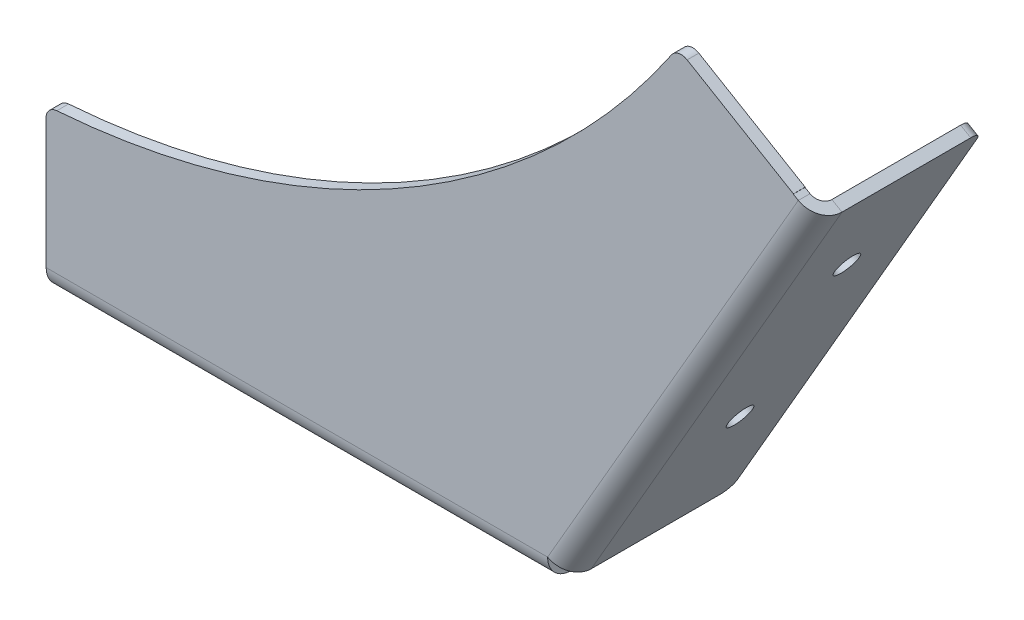
ISO-10303-21;
HEADER;
FILE_DESCRIPTION(('STEP AP214'),'2;1');
FILE_NAME('part.step','',(''),(''),'','','');
FILE_SCHEMA(('AUTOMOTIVE_DESIGN { 1 0 10303 214 1 1 1 1 }'));
ENDSEC;
DATA;
#1=APPLICATION_CONTEXT('core data for automotive mechanical design processes');
#2=APPLICATION_PROTOCOL_DEFINITION('international standard','automotive_design',2000,#1);
#3=PRODUCT_CONTEXT('',#1,'mechanical');
#4=PRODUCT('Part','Part','',(#3));
#5=PRODUCT_RELATED_PRODUCT_CATEGORY('part','',(#4));
#6=PRODUCT_DEFINITION_FORMATION('','',#4);
#7=PRODUCT_DEFINITION_CONTEXT('part definition',#1,'design');
#8=PRODUCT_DEFINITION('design','',#6,#7);
#9=PRODUCT_DEFINITION_SHAPE('','',#8);
#10=(LENGTH_UNIT() NAMED_UNIT(*) SI_UNIT(.MILLI.,.METRE.));
#11=(NAMED_UNIT(*) PLANE_ANGLE_UNIT() SI_UNIT($,.RADIAN.));
#12=(NAMED_UNIT(*) SI_UNIT($,.STERADIAN.) SOLID_ANGLE_UNIT());
#13=UNCERTAINTY_MEASURE_WITH_UNIT(LENGTH_MEASURE(1.E-05),#10,'distance_accuracy_value','');
#14=(GEOMETRIC_REPRESENTATION_CONTEXT(3) GLOBAL_UNCERTAINTY_ASSIGNED_CONTEXT((#13)) GLOBAL_UNIT_ASSIGNED_CONTEXT((#10,
#11,#12)) REPRESENTATION_CONTEXT('',''));
#15=CARTESIAN_POINT('',(0.,0.,0.));
#16=DIRECTION('',(0.,0.,1.));
#17=DIRECTION('',(1.,0.,0.));
#18=AXIS2_PLACEMENT_3D('',#15,#16,#17);
#19=CARTESIAN_POINT('',(0.,0.,-3.175));
#20=DIRECTION('',(0.,0.,-1.));
#21=DIRECTION('',(-1.,0.,0.));
#22=AXIS2_PLACEMENT_3D('',#19,#20,#21);
#23=PLANE('',#22);
#24=CARTESIAN_POINT('',(-152.954688879474,264.874673897743,-3.175));
#25=DIRECTION('',(0.,0.,-1.));
#26=DIRECTION('',(-1.,0.,0.));
#27=AXIS2_PLACEMENT_3D('',#24,#25,#26);
#28=CIRCLE('',#27,220.82);
#29=CARTESIAN_POINT('',(-136.801771923831,44.6462568534753,-3.175));
#30=VERTEX_POINT('',#29);
#31=CARTESIAN_POINT('',(29.9387036206047,141.135111187137,-3.175));
#32=VERTEX_POINT('',#31);
#33=EDGE_CURVE('E440',#30,#32,#28,.F.);
#34=ORIENTED_EDGE('',*,*,#33,.T.);
#35=CARTESIAN_POINT('',(32.5683862634257,139.355955713873,-3.175));
#36=DIRECTION('',(0.,0.,-1.));
#37=DIRECTION('',(-1.,0.,0.));
#38=AXIS2_PLACEMENT_3D('',#35,#36,#37);
#39=CIRCLE('',#38,3.175);
#40=CARTESIAN_POINT('',(34.1853078788145,142.088388602287,-3.175));
#41=VERTEX_POINT('',#40);
#42=EDGE_CURVE('E482',#32,#41,#39,.T.);
#43=ORIENTED_EDGE('',*,*,#42,.T.);
#44=DIRECTION('',(0.860608783752555,-0.509266650516159,0.));
#45=VECTOR('',#44,1.);
#46=CARTESIAN_POINT('',(31.595939562204,143.620651524126,-3.175));
#47=LINE('',#46,#45);
#48=CARTESIAN_POINT('',(63.0185242498125,125.026285818675,-3.17499999999999));
#49=VERTEX_POINT('',#48);
#50=EDGE_CURVE('E408',#41,#49,#47,.T.);
#51=ORIENTED_EDGE('',*,*,#50,.T.);
#52=DIRECTION('',(0.500000000000037,0.866025403784417,0.));
#53=VECTOR('',#52,1.);
#54=CARTESIAN_POINT('',(62.9759233574662,124.952498908683,-3.17499999999999));
#55=LINE('',#54,#53);
#56=CARTESIAN_POINT('',(62.9759233574662,124.952498908683,-3.17499999999999));
#57=VERTEX_POINT('',#56);
#58=EDGE_CURVE('E382',#57,#49,#55,.T.);
#59=ORIENTED_EDGE('',*,*,#58,.F.);
#60=DIRECTION('',(-0.86602540378442,0.500000000000033,0.));
#61=VECTOR('',#60,1.);
#62=CARTESIAN_POINT('',(64.350738685974,124.158748908683,-3.17499999999999));
#63=LINE('',#62,#61);
#64=CARTESIAN_POINT('',(64.350738685974,124.158748908683,-3.17499999999999));
#65=VERTEX_POINT('',#64);
#66=EDGE_CURVE('E377',#65,#57,#63,.T.);
#67=ORIENTED_EDGE('',*,*,#66,.F.);
#68=DIRECTION('',(-0.500000000000036,-0.866025403784418,0.));
#69=VECTOR('',#68,1.);
#70=CARTESIAN_POINT('',(-3.66617420935395,6.35,-3.17499999999999));
#71=LINE('',#70,#69);
#72=CARTESIAN_POINT('',(-3.66617420935391,6.35000000000004,-3.175));
#73=VERTEX_POINT('',#72);
#74=EDGE_CURVE('E300',#73,#65,#71,.F.);
#75=ORIENTED_EDGE('',*,*,#74,.F.);
#76=DIRECTION('',(-1.,0.,0.));
#77=VECTOR('',#76,1.);
#78=CARTESIAN_POINT('',(-139.7,6.34999999999999,-3.17499999999999));
#79=LINE('',#78,#77);
#80=CARTESIAN_POINT('',(-139.7,6.34999999999999,-3.175));
#81=VERTEX_POINT('',#80);
#82=EDGE_CURVE('E363',#81,#73,#79,.F.);
#83=ORIENTED_EDGE('',*,*,#82,.F.);
#84=DIRECTION('',(0.,-1.,0.));
#85=VECTOR('',#84,1.);
#86=CARTESIAN_POINT('',(-139.7,7.93749999999999,-3.17499999999999));
#87=LINE('',#86,#85);
#88=CARTESIAN_POINT('',(-139.7,7.93749999999999,-3.175));
#89=VERTEX_POINT('',#88);
#90=EDGE_CURVE('E397',#89,#81,#87,.T.);
#91=ORIENTED_EDGE('',*,*,#90,.F.);
#92=DIRECTION('',(1.,0.,0.));
#93=VECTOR('',#92,1.);
#94=CARTESIAN_POINT('',(-141.2875,7.93749999999999,-3.17499999999999));
#95=LINE('',#94,#93);
#96=CARTESIAN_POINT('',(-139.708519935512,7.93749999999999,-3.175));
#97=VERTEX_POINT('',#96);
#98=EDGE_CURVE('E392',#97,#89,#95,.T.);
#99=ORIENTED_EDGE('',*,*,#98,.F.);
#100=DIRECTION('',(-0.00107337708400898,0.999999423930652,0.));
#101=VECTOR('',#100,1.);
#102=CARTESIAN_POINT('',(-139.7,0.,-3.175));
#103=LINE('',#102,#101);
#104=CARTESIAN_POINT('',(-139.744519794412,41.4763547950296,-3.175));
#105=VERTEX_POINT('',#104);
#106=EDGE_CURVE('E411',#97,#105,#103,.T.);
#107=ORIENTED_EDGE('',*,*,#106,.T.);
#108=CARTESIAN_POINT('',(-136.569521623432,41.4797627672714,-3.175));
#109=DIRECTION('',(0.,0.,-1.));
#110=DIRECTION('',(-1.,0.,0.));
#111=AXIS2_PLACEMENT_3D('',#108,#109,#110);
#112=CIRCLE('',#111,3.175);
#113=EDGE_CURVE('E479',#105,#30,#112,.T.);
#114=ORIENTED_EDGE('',*,*,#113,.T.);
#115=EDGE_LOOP('',(#34,#43,#51,#59,#67,#75,#83,#91,#99,#107,#114));
#116=FACE_BOUND('',#115,.T.);
#117=ADVANCED_FACE('F84',(#116),#23,.T.);
#118=CARTESIAN_POINT('',(0.,0.,0.));
#119=DIRECTION('',(0.,0.,-1.));
#120=DIRECTION('',(-1.,0.,0.));
#121=AXIS2_PLACEMENT_3D('',#118,#119,#120);
#122=PLANE('',#121);
#123=DIRECTION('',(0.860608783752555,-0.509266650516159,0.));
#124=VECTOR('',#123,1.);
#125=CARTESIAN_POINT('',(31.595939562204,143.620651524126,0.));
#126=LINE('',#125,#124);
#127=CARTESIAN_POINT('',(34.1853078788145,142.088388602287,0.));
#128=VERTEX_POINT('',#127);
#129=CARTESIAN_POINT('',(63.0185242498125,125.026285818675,0.));
#130=VERTEX_POINT('',#129);
#131=EDGE_CURVE('E407',#128,#130,#126,.T.);
#132=ORIENTED_EDGE('',*,*,#131,.F.);
#133=CARTESIAN_POINT('',(32.5683862634257,139.355955713873,0.));
#134=DIRECTION('',(0.,0.,-1.));
#135=DIRECTION('',(-1.,0.,0.));
#136=AXIS2_PLACEMENT_3D('',#133,#134,#135);
#137=CIRCLE('',#136,3.175);
#138=CARTESIAN_POINT('',(29.9387036206047,141.135111187137,0.));
#139=VERTEX_POINT('',#138);
#140=EDGE_CURVE('E469',#128,#139,#137,.F.);
#141=ORIENTED_EDGE('',*,*,#140,.T.);
#142=CARTESIAN_POINT('',(-152.954688879474,264.874673897743,0.));
#143=DIRECTION('',(0.,0.,-1.));
#144=DIRECTION('',(-1.,0.,0.));
#145=AXIS2_PLACEMENT_3D('',#142,#143,#144);
#146=CIRCLE('',#145,220.82);
#147=CARTESIAN_POINT('',(-136.801771923831,44.6462568534753,0.));
#148=VERTEX_POINT('',#147);
#149=EDGE_CURVE('E436',#139,#148,#146,.T.);
#150=ORIENTED_EDGE('',*,*,#149,.T.);
#151=CARTESIAN_POINT('',(-136.569521623432,41.4797627672714,0.));
#152=DIRECTION('',(0.,0.,-1.));
#153=DIRECTION('',(-1.,0.,0.));
#154=AXIS2_PLACEMENT_3D('',#151,#152,#153);
#155=CIRCLE('',#154,3.175);
#156=CARTESIAN_POINT('',(-139.744519794412,41.4763547950296,0.));
#157=VERTEX_POINT('',#156);
#158=EDGE_CURVE('E466',#148,#157,#155,.F.);
#159=ORIENTED_EDGE('',*,*,#158,.T.);
#160=DIRECTION('',(-0.00107337708400898,0.999999423930652,0.));
#161=VECTOR('',#160,1.);
#162=CARTESIAN_POINT('',(-139.7,0.,0.));
#163=LINE('',#162,#161);
#164=CARTESIAN_POINT('',(-139.708519935512,7.93749999999999,0.));
#165=VERTEX_POINT('',#164);
#166=EDGE_CURVE('E412',#165,#157,#163,.T.);
#167=ORIENTED_EDGE('',*,*,#166,.F.);
#168=DIRECTION('',(-1.,0.,0.));
#169=VECTOR('',#168,1.);
#170=CARTESIAN_POINT('',(0.,7.93749999999999,0.));
#171=LINE('',#170,#169);
#172=CARTESIAN_POINT('',(-139.7,7.93749999999999,0.));
#173=VERTEX_POINT('',#172);
#174=EDGE_CURVE('E425',#173,#165,#171,.T.);
#175=ORIENTED_EDGE('',*,*,#174,.F.);
#176=DIRECTION('',(0.,1.,0.));
#177=VECTOR('',#176,1.);
#178=CARTESIAN_POINT('',(-139.7,0.,0.));
#179=LINE('',#178,#177);
#180=CARTESIAN_POINT('',(-139.7,6.35,0.));
#181=VERTEX_POINT('',#180);
#182=EDGE_CURVE('E416',#181,#173,#179,.T.);
#183=ORIENTED_EDGE('',*,*,#182,.F.);
#184=DIRECTION('',(-1.,0.,0.));
#185=VECTOR('',#184,1.);
#186=CARTESIAN_POINT('',(-139.7,6.35,0.));
#187=LINE('',#186,#185);
#188=CARTESIAN_POINT('',(-3.66617420935394,6.35000000000001,0.));
#189=VERTEX_POINT('',#188);
#190=EDGE_CURVE('E346',#181,#189,#187,.F.);
#191=ORIENTED_EDGE('',*,*,#190,.T.);
#192=DIRECTION('',(-0.500000000000036,-0.866025403784418,0.));
#193=VECTOR('',#192,1.);
#194=CARTESIAN_POINT('',(-3.66617420935395,6.35,0.));
#195=LINE('',#194,#193);
#196=CARTESIAN_POINT('',(64.350738685974,124.158748908683,0.));
#197=VERTEX_POINT('',#196);
#198=EDGE_CURVE('E248',#189,#197,#195,.F.);
#199=ORIENTED_EDGE('',*,*,#198,.T.);
#200=DIRECTION('',(0.86602540378442,-0.500000000000033,0.));
#201=VECTOR('',#200,1.);
#202=CARTESIAN_POINT('',(69.8500000000046,120.983748908683,0.));
#203=LINE('',#202,#201);
#204=CARTESIAN_POINT('',(62.9759233574662,124.952498908683,0.));
#205=VERTEX_POINT('',#204);
#206=EDGE_CURVE('E433',#205,#197,#203,.T.);
#207=ORIENTED_EDGE('',*,*,#206,.F.);
#208=DIRECTION('',(-0.500000000000037,-0.866025403784418,0.));
#209=VECTOR('',#208,1.);
#210=CARTESIAN_POINT('',(-6.87407664253891,3.96875000000035,0.));
#211=LINE('',#210,#209);
#212=EDGE_CURVE('E381',#130,#205,#211,.T.);
#213=ORIENTED_EDGE('',*,*,#212,.F.);
#214=EDGE_LOOP('',(#132,#141,#150,#159,#167,#175,#183,#191,#199,#207,#213));
#215=FACE_BOUND('',#214,.T.);
#216=ADVANCED_FACE('F607',(#215),#122,.F.);
#217=CARTESIAN_POINT('',(31.595939562204,143.620651524126,-3.175));
#218=DIRECTION('',(-0.509266650516159,-0.860608783752555,0.));
#219=DIRECTION('',(0.860608783752555,-0.509266650516159,0.));
#220=AXIS2_PLACEMENT_3D('',#217,#218,#219);
#221=PLANE('',#220);
#222=ORIENTED_EDGE('',*,*,#50,.F.);
#223=DIRECTION('',(0.,0.,-1.));
#224=VECTOR('',#223,1.);
#225=CARTESIAN_POINT('',(34.1853078788145,142.088388602287,-3.175));
#226=LINE('',#225,#224);
#227=EDGE_CURVE('E444',#41,#128,#226,.F.);
#228=ORIENTED_EDGE('',*,*,#227,.T.);
#229=ORIENTED_EDGE('',*,*,#131,.T.);
#230=DIRECTION('',(0.,0.,1.));
#231=VECTOR('',#230,1.);
#232=CARTESIAN_POINT('',(63.0185242498125,125.026285818675,-3.175));
#233=LINE('',#232,#231);
#234=EDGE_CURVE('E429',#49,#130,#233,.T.);
#235=ORIENTED_EDGE('',*,*,#234,.F.);
#236=EDGE_LOOP('',(#222,#228,#229,#235));
#237=FACE_BOUND('',#236,.T.);
#238=ADVANCED_FACE('F613',(#237),#221,.F.);
#239=CARTESIAN_POINT('',(-139.7,0.,-3.175));
#240=DIRECTION('',(0.999999423930652,0.00107337708400898,0.));
#241=DIRECTION('',(-0.00107337708400898,0.999999423930652,0.));
#242=AXIS2_PLACEMENT_3D('',#239,#240,#241);
#243=PLANE('',#242);
#244=ORIENTED_EDGE('',*,*,#166,.T.);
#245=DIRECTION('',(0.,0.,-1.));
#246=VECTOR('',#245,1.);
#247=CARTESIAN_POINT('',(-139.744519794412,41.4763547950296,-3.175));
#248=LINE('',#247,#246);
#249=EDGE_CURVE('E485',#157,#105,#248,.T.);
#250=ORIENTED_EDGE('',*,*,#249,.T.);
#251=ORIENTED_EDGE('',*,*,#106,.F.);
#252=DIRECTION('',(0.,0.,-1.));
#253=VECTOR('',#252,1.);
#254=CARTESIAN_POINT('',(-139.708519935512,7.93749999999999,-3.175));
#255=LINE('',#254,#253);
#256=EDGE_CURVE('E396',#165,#97,#255,.T.);
#257=ORIENTED_EDGE('',*,*,#256,.F.);
#258=EDGE_LOOP('',(#244,#250,#251,#257));
#259=FACE_BOUND('',#258,.T.);
#260=ADVANCED_FACE('F620',(#259),#243,.F.);
#261=CARTESIAN_POINT('',(-141.2875,7.93749999999999,-3.17499999999999));
#262=DIRECTION('',(0.,-1.,0.));
#263=DIRECTION('',(0.,0.,-1.));
#264=AXIS2_PLACEMENT_3D('',#261,#262,#263);
#265=PLANE('',#264);
#266=ORIENTED_EDGE('',*,*,#174,.T.);
#267=ORIENTED_EDGE('',*,*,#256,.T.);
#268=ORIENTED_EDGE('',*,*,#98,.T.);
#269=DIRECTION('',(0.,0.,1.));
#270=VECTOR('',#269,1.);
#271=CARTESIAN_POINT('',(-139.7,7.93749999999999,-3.17499999999999));
#272=LINE('',#271,#270);
#273=EDGE_CURVE('E391',#89,#173,#272,.T.);
#274=ORIENTED_EDGE('',*,*,#273,.T.);
#275=EDGE_LOOP('',(#266,#267,#268,#274));
#276=FACE_BOUND('',#275,.T.);
#277=ADVANCED_FACE('F617',(#276),#265,.T.);
#278=CARTESIAN_POINT('',(-139.7,7.93749999999999,-3.17499999999999));
#279=DIRECTION('',(-1.,0.,0.));
#280=DIRECTION('',(0.,0.,1.));
#281=AXIS2_PLACEMENT_3D('',#278,#279,#280);
#282=PLANE('',#281);
#283=DIRECTION('',(0.,0.,1.));
#284=VECTOR('',#283,1.);
#285=CARTESIAN_POINT('',(-139.7,6.34999999999999,-3.17499999999999));
#286=LINE('',#285,#284);
#287=EDGE_CURVE('E355',#81,#181,#286,.T.);
#288=ORIENTED_EDGE('',*,*,#287,.T.);
#289=ORIENTED_EDGE('',*,*,#182,.T.);
#290=ORIENTED_EDGE('',*,*,#273,.F.);
#291=ORIENTED_EDGE('',*,*,#90,.T.);
#292=EDGE_LOOP('',(#288,#289,#290,#291));
#293=FACE_BOUND('',#292,.T.);
#294=ADVANCED_FACE('F675',(#293),#282,.T.);
#295=CARTESIAN_POINT('',(64.350738685974,124.158748908683,-3.17499999999999));
#296=DIRECTION('',(0.500000000000033,0.86602540378442,0.));
#297=DIRECTION('',(-0.86602540378442,0.500000000000033,0.));
#298=AXIS2_PLACEMENT_3D('',#295,#296,#297);
#299=PLANE('',#298);
#300=DIRECTION('',(0.,0.,1.));
#301=VECTOR('',#300,1.);
#302=CARTESIAN_POINT('',(62.9759233574662,124.952498908683,-3.17499999999999));
#303=LINE('',#302,#301);
#304=EDGE_CURVE('E374',#57,#205,#303,.T.);
#305=ORIENTED_EDGE('',*,*,#304,.T.);
#306=ORIENTED_EDGE('',*,*,#206,.T.);
#307=DIRECTION('',(0.,0.,1.));
#308=VECTOR('',#307,1.);
#309=CARTESIAN_POINT('',(64.350738685974,124.158748908683,-3.17499999999999));
#310=LINE('',#309,#308);
#311=EDGE_CURVE('E295',#65,#197,#310,.T.);
#312=ORIENTED_EDGE('',*,*,#311,.F.);
#313=ORIENTED_EDGE('',*,*,#66,.T.);
#314=EDGE_LOOP('',(#305,#306,#312,#313));
#315=FACE_BOUND('',#314,.T.);
#316=ADVANCED_FACE('F704',(#315),#299,.T.);
#317=CARTESIAN_POINT('',(62.9759233574662,124.952498908683,-3.17499999999999));
#318=DIRECTION('',(0.866025403784417,-0.500000000000037,0.));
#319=DIRECTION('',(0.500000000000037,0.866025403784417,0.));
#320=AXIS2_PLACEMENT_3D('',#317,#318,#319);
#321=PLANE('',#320);
#322=ORIENTED_EDGE('',*,*,#234,.T.);
#323=ORIENTED_EDGE('',*,*,#212,.T.);
#324=ORIENTED_EDGE('',*,*,#304,.F.);
#325=ORIENTED_EDGE('',*,*,#58,.T.);
#326=EDGE_LOOP('',(#322,#323,#324,#325));
#327=FACE_BOUND('',#326,.T.);
#328=ADVANCED_FACE('F702',(#327),#321,.T.);
#329=CARTESIAN_POINT('',(-3.66617420935395,6.35,-6.35));
#330=DIRECTION('',(1.,0.,0.));
#331=DIRECTION('',(0.,1.,0.));
#332=AXIS2_PLACEMENT_3D('',#329,#330,#331);
#333=PLANE('',#332);
#334=DIRECTION('',(0.,1.,0.));
#335=VECTOR('',#334,1.);
#336=CARTESIAN_POINT('',(-3.66617420935394,3.17499999999999,-6.34999999999999));
#337=LINE('',#336,#335);
#338=CARTESIAN_POINT('',(-3.66617420935394,0.,-6.34999999999998));
#339=VERTEX_POINT('',#338);
#340=CARTESIAN_POINT('',(-3.66617420935395,3.17499999999999,-6.34999999999999));
#341=VERTEX_POINT('',#340);
#342=EDGE_CURVE('E310',#339,#341,#337,.T.);
#343=ORIENTED_EDGE('',*,*,#342,.T.);
#344=CARTESIAN_POINT('',(-3.66617420935395,6.35,-6.35));
#345=DIRECTION('',(-1.,0.,0.));
#346=DIRECTION('',(0.,-1.,0.));
#347=AXIS2_PLACEMENT_3D('',#344,#345,#346);
#348=CIRCLE('',#347,3.17500000000001);
#349=EDGE_CURVE('E359',#73,#341,#348,.F.);
#350=ORIENTED_EDGE('',*,*,#349,.F.);
#351=DIRECTION('',(0.,0.,1.));
#352=VECTOR('',#351,1.);
#353=CARTESIAN_POINT('',(-3.66617420935395,6.35000000000001,-3.17499999999999));
#354=LINE('',#353,#352);
#355=EDGE_CURVE('E370',#73,#189,#354,.T.);
#356=ORIENTED_EDGE('',*,*,#355,.T.);
#357=CARTESIAN_POINT('',(-3.66617420935395,6.35,-6.35));
#358=DIRECTION('',(-1.,0.,0.));
#359=DIRECTION('',(0.,-1.,0.));
#360=AXIS2_PLACEMENT_3D('',#357,#358,#359);
#361=CIRCLE('',#360,6.35000000000001);
#362=EDGE_CURVE('E350',#189,#339,#361,.F.);
#363=ORIENTED_EDGE('',*,*,#362,.T.);
#364=EDGE_LOOP('',(#343,#350,#356,#363));
#365=FACE_BOUND('',#364,.T.);
#366=ADVANCED_FACE('F667',(#365),#333,.T.);
#367=CARTESIAN_POINT('',(-139.7,6.34999999999998,-6.35));
#368=DIRECTION('',(1.,0.,0.));
#369=DIRECTION('',(0.,1.,0.));
#370=AXIS2_PLACEMENT_3D('',#367,#368,#369);
#371=PLANE('',#370);
#372=CARTESIAN_POINT('',(-139.7,6.34999999999998,-6.35));
#373=DIRECTION('',(-1.,0.,0.));
#374=DIRECTION('',(0.,-1.,0.));
#375=AXIS2_PLACEMENT_3D('',#372,#373,#374);
#376=CIRCLE('',#375,3.17500000000001);
#377=CARTESIAN_POINT('',(-139.7,3.17499999999997,-6.34999999999999));
#378=VERTEX_POINT('',#377);
#379=EDGE_CURVE('E313',#378,#81,#376,.T.);
#380=ORIENTED_EDGE('',*,*,#379,.F.);
#381=DIRECTION('',(0.,-1.,0.));
#382=VECTOR('',#381,1.);
#383=CARTESIAN_POINT('',(-139.7,3.17499999999999,-6.34999999999999));
#384=LINE('',#383,#382);
#385=CARTESIAN_POINT('',(-139.7,0.,-6.34999999999998));
#386=VERTEX_POINT('',#385);
#387=EDGE_CURVE('E332',#378,#386,#384,.T.);
#388=ORIENTED_EDGE('',*,*,#387,.T.);
#389=CARTESIAN_POINT('',(-139.7,6.34999999999998,-6.35));
#390=DIRECTION('',(-1.,0.,0.));
#391=DIRECTION('',(0.,-1.,0.));
#392=AXIS2_PLACEMENT_3D('',#389,#390,#391);
#393=CIRCLE('',#392,6.35000000000001);
#394=EDGE_CURVE('E351',#386,#181,#393,.T.);
#395=ORIENTED_EDGE('',*,*,#394,.T.);
#396=ORIENTED_EDGE('',*,*,#287,.F.);
#397=EDGE_LOOP('',(#380,#388,#395,#396));
#398=FACE_BOUND('',#397,.T.);
#399=ADVANCED_FACE('F678',(#398),#371,.F.);
#400=CARTESIAN_POINT('',(-139.7,6.34999999999998,-6.35));
#401=DIRECTION('',(-1.,0.,0.));
#402=DIRECTION('',(0.,-1.,0.));
#403=AXIS2_PLACEMENT_3D('',#400,#401,#402);
#404=CYLINDRICAL_SURFACE('',#403,6.35000000000001);
#405=ORIENTED_EDGE('',*,*,#190,.F.);
#406=ORIENTED_EDGE('',*,*,#394,.F.);
#407=DIRECTION('',(-1.,0.,0.));
#408=VECTOR('',#407,1.);
#409=CARTESIAN_POINT('',(0.,0.,-6.34999999999998));
#410=LINE('',#409,#408);
#411=EDGE_CURVE('E328',#339,#386,#410,.T.);
#412=ORIENTED_EDGE('',*,*,#411,.F.);
#413=ORIENTED_EDGE('',*,*,#362,.F.);
#414=EDGE_LOOP('',(#405,#406,#412,#413));
#415=FACE_BOUND('',#414,.T.);
#416=ADVANCED_FACE('F683',(#415),#404,.T.);
#417=CARTESIAN_POINT('',(-139.7,6.34999999999998,-6.35));
#418=DIRECTION('',(-1.,0.,0.));
#419=DIRECTION('',(0.,-1.,0.));
#420=AXIS2_PLACEMENT_3D('',#417,#418,#419);
#421=CYLINDRICAL_SURFACE('',#420,3.17500000000001);
#422=ORIENTED_EDGE('',*,*,#82,.T.);
#423=ORIENTED_EDGE('',*,*,#349,.T.);
#424=DIRECTION('',(1.,0.,0.));
#425=VECTOR('',#424,1.);
#426=CARTESIAN_POINT('',(0.,3.17499999999999,-6.34999999999999));
#427=LINE('',#426,#425);
#428=EDGE_CURVE('E336',#341,#378,#427,.F.);
#429=ORIENTED_EDGE('',*,*,#428,.T.);
#430=ORIENTED_EDGE('',*,*,#379,.T.);
#431=EDGE_LOOP('',(#422,#423,#429,#430));
#432=FACE_BOUND('',#431,.T.);
#433=ADVANCED_FACE('F669',(#432),#421,.F.);
#434=CARTESIAN_POINT('',(-3.66617420935394,3.175,-3.175));
#435=DIRECTION('',(1.,0.,0.));
#436=DIRECTION('',(0.,0.,-1.));
#437=AXIS2_PLACEMENT_3D('',#434,#435,#436);
#438=PLANE('',#437);
#439=DIRECTION('',(0.,0.,1.));
#440=VECTOR('',#439,1.);
#441=CARTESIAN_POINT('',(-3.66617420935394,0.,0.));
#442=LINE('',#441,#440);
#443=CARTESIAN_POINT('',(-3.66617420935394,-1.32835189666901E-13,-41.275));
#444=VERTEX_POINT('',#443);
#445=EDGE_CURVE('E340',#444,#339,#442,.T.);
#446=ORIENTED_EDGE('',*,*,#445,.F.);
#447=DIRECTION('',(0.,-1.,0.));
#448=VECTOR('',#447,1.);
#449=CARTESIAN_POINT('',(-3.66617420935394,3.17499999999987,-41.275));
#450=LINE('',#449,#448);
#451=CARTESIAN_POINT('',(-3.66617420935394,3.17499999999987,-41.275));
#452=VERTEX_POINT('',#451);
#453=EDGE_CURVE('E13',#444,#452,#450,.F.);
#454=ORIENTED_EDGE('',*,*,#453,.T.);
#455=DIRECTION('',(0.,0.,1.));
#456=VECTOR('',#455,1.);
#457=CARTESIAN_POINT('',(-3.66617420935394,3.17500000000001,0.));
#458=LINE('',#457,#456);
#459=EDGE_CURVE('E309',#341,#452,#458,.F.);
#460=ORIENTED_EDGE('',*,*,#459,.F.);
#461=ORIENTED_EDGE('',*,*,#342,.F.);
#462=EDGE_LOOP('',(#446,#454,#460,#461));
#463=FACE_BOUND('',#462,.T.);
#464=ADVANCED_FACE('F662',(#463),#438,.T.);
#465=CARTESIAN_POINT('',(0.,0.,0.));
#466=DIRECTION('',(0.,-1.,0.));
#467=DIRECTION('',(0.,0.,-1.));
#468=AXIS2_PLACEMENT_3D('',#465,#466,#467);
#469=PLANE('',#468);
#470=CARTESIAN_POINT('',(-104.22382,-1.01447362762407E-13,-25.4));
#471=DIRECTION('',(0.,-1.,0.));
#472=DIRECTION('',(0.,0.,-1.));
#473=AXIS2_PLACEMENT_3D('',#470,#471,#472);
#474=CIRCLE('',#473,3.3734375);
#475=CARTESIAN_POINT('',(-104.22382,-1.1322565684141E-13,-28.7734375));
#476=VERTEX_POINT('',#475);
#477=EDGE_CURVE('E458',#476,#476,#474,.T.);
#478=ORIENTED_EDGE('',*,*,#477,.F.);
#479=EDGE_LOOP('',(#478));
#480=FACE_BOUND('',#479,.T.);
#481=CARTESIAN_POINT('',(-46.284161686,0.,-25.4));
#482=DIRECTION('',(0.,-1.,0.));
#483=DIRECTION('',(0.,0.,-1.));
#484=AXIS2_PLACEMENT_3D('',#481,#482,#483);
#485=CIRCLE('',#484,3.37343750000001);
#486=CARTESIAN_POINT('',(-46.284161686,-1.06130095131617E-13,-28.7734375));
#487=VERTEX_POINT('',#486);
#488=EDGE_CURVE('E1048',#487,#487,#485,.T.);
#489=ORIENTED_EDGE('',*,*,#488,.F.);
#490=EDGE_LOOP('',(#489));
#491=FACE_BOUND('',#490,.T.);
#492=DIRECTION('',(0.,0.,1.));
#493=VECTOR('',#492,1.);
#494=CARTESIAN_POINT('',(-139.7,0.,-3.17499999999999));
#495=LINE('',#494,#493);
#496=CARTESIAN_POINT('',(-139.7,-1.33025439009923E-13,-41.275));
#497=VERTEX_POINT('',#496);
#498=EDGE_CURVE('E314',#497,#386,#495,.T.);
#499=ORIENTED_EDGE('',*,*,#498,.F.);
#500=CARTESIAN_POINT('',(-136.525,-1.32835189666901E-13,-41.275));
#501=DIRECTION('',(0.,-1.,0.));
#502=DIRECTION('',(0.,0.,-1.));
#503=AXIS2_PLACEMENT_3D('',#500,#501,#502);
#504=CIRCLE('',#503,3.175);
#505=CARTESIAN_POINT('',(-136.525,-1.43982048506075E-13,-44.45));
#506=VERTEX_POINT('',#505);
#507=EDGE_CURVE('E508',#497,#506,#504,.T.);
#508=ORIENTED_EDGE('',*,*,#507,.T.);
#509=DIRECTION('',(-1.,0.,0.));
#510=VECTOR('',#509,1.);
#511=CARTESIAN_POINT('',(-139.7,-1.43982048506075E-13,-44.45));
#512=LINE('',#511,#510);
#513=CARTESIAN_POINT('',(-6.84117420935393,-1.43982048506075E-13,-44.45));
#514=VERTEX_POINT('',#513);
#515=EDGE_CURVE('E317',#514,#506,#512,.T.);
#516=ORIENTED_EDGE('',*,*,#515,.F.);
#517=CARTESIAN_POINT('',(-6.84117420935393,-1.32835189666901E-13,-41.275));
#518=DIRECTION('',(0.,-1.,0.));
#519=DIRECTION('',(0.,0.,-1.));
#520=AXIS2_PLACEMENT_3D('',#517,#518,#519);
#521=CIRCLE('',#520,3.175);
#522=EDGE_CURVE('E505',#514,#444,#521,.T.);
#523=ORIENTED_EDGE('',*,*,#522,.T.);
#524=ORIENTED_EDGE('',*,*,#445,.T.);
#525=ORIENTED_EDGE('',*,*,#411,.T.);
#526=EDGE_LOOP('',(#499,#508,#516,#523,#524,#525));
#527=FACE_BOUND('',#526,.T.);
#528=ADVANCED_FACE('F651',(#480,#491,#527),#469,.T.);
#529=CARTESIAN_POINT('',(0.,3.17500000000001,0.));
#530=DIRECTION('',(0.,-1.,0.));
#531=DIRECTION('',(0.,0.,-1.));
#532=AXIS2_PLACEMENT_3D('',#529,#530,#531);
#533=PLANE('',#532);
#534=CARTESIAN_POINT('',(-104.22382,3.17499999999993,-25.4));
#535=DIRECTION('',(0.,-1.,0.));
#536=DIRECTION('',(0.,0.,-1.));
#537=AXIS2_PLACEMENT_3D('',#534,#535,#536);
#538=CIRCLE('',#537,3.3734375);
#539=CARTESIAN_POINT('',(-104.22382,3.17499999999992,-28.7734375));
#540=VERTEX_POINT('',#539);
#541=EDGE_CURVE('E457',#540,#540,#538,.T.);
#542=ORIENTED_EDGE('',*,*,#541,.T.);
#543=EDGE_LOOP('',(#542));
#544=FACE_BOUND('',#543,.T.);
#545=CARTESIAN_POINT('',(-46.284161686,3.17499999999993,-25.4));
#546=DIRECTION('',(0.,-1.,0.));
#547=DIRECTION('',(0.,0.,-1.));
#548=AXIS2_PLACEMENT_3D('',#545,#546,#547);
#549=CIRCLE('',#548,3.37343750000001);
#550=CARTESIAN_POINT('',(-46.284161686,3.17499999999992,-28.7734375));
#551=VERTEX_POINT('',#550);
#552=EDGE_CURVE('E453',#551,#551,#549,.T.);
#553=ORIENTED_EDGE('',*,*,#552,.T.);
#554=EDGE_LOOP('',(#553));
#555=FACE_BOUND('',#554,.T.);
#556=DIRECTION('',(1.,0.,0.));
#557=VECTOR('',#556,1.);
#558=CARTESIAN_POINT('',(0.,3.17499999999986,-44.45));
#559=LINE('',#558,#557);
#560=CARTESIAN_POINT('',(-6.84117420935393,3.17499999999986,-44.45));
#561=VERTEX_POINT('',#560);
#562=CARTESIAN_POINT('',(-136.525,3.17499999999986,-44.45));
#563=VERTEX_POINT('',#562);
#564=EDGE_CURVE('E324',#561,#563,#559,.F.);
#565=ORIENTED_EDGE('',*,*,#564,.T.);
#566=CARTESIAN_POINT('',(-136.525,3.17499999999987,-41.275));
#567=DIRECTION('',(0.,-1.,0.));
#568=DIRECTION('',(0.,0.,-1.));
#569=AXIS2_PLACEMENT_3D('',#566,#567,#568);
#570=CIRCLE('',#569,3.175);
#571=CARTESIAN_POINT('',(-139.7,3.17499999999987,-41.275));
#572=VERTEX_POINT('',#571);
#573=EDGE_CURVE('E499',#563,#572,#570,.F.);
#574=ORIENTED_EDGE('',*,*,#573,.T.);
#575=DIRECTION('',(0.,0.,-1.));
#576=VECTOR('',#575,1.);
#577=CARTESIAN_POINT('',(-139.7,3.17500000000001,0.));
#578=LINE('',#577,#576);
#579=EDGE_CURVE('E321',#572,#378,#578,.F.);
#580=ORIENTED_EDGE('',*,*,#579,.T.);
#581=ORIENTED_EDGE('',*,*,#428,.F.);
#582=ORIENTED_EDGE('',*,*,#459,.T.);
#583=CARTESIAN_POINT('',(-6.84117420935393,3.17499999999987,-41.275));
#584=DIRECTION('',(0.,-1.,0.));
#585=DIRECTION('',(0.,0.,-1.));
#586=AXIS2_PLACEMENT_3D('',#583,#584,#585);
#587=CIRCLE('',#586,3.175);
#588=EDGE_CURVE('E496',#452,#561,#587,.F.);
#589=ORIENTED_EDGE('',*,*,#588,.T.);
#590=EDGE_LOOP('',(#565,#574,#580,#581,#582,#589));
#591=FACE_BOUND('',#590,.T.);
#592=ADVANCED_FACE('F724',(#544,#555,#591),#533,.F.);
#593=CARTESIAN_POINT('',(-139.7,-1.43982048506075E-13,-44.45));
#594=DIRECTION('',(0.,0.,-1.));
#595=DIRECTION('',(0.,1.,0.));
#596=AXIS2_PLACEMENT_3D('',#593,#594,#595);
#597=PLANE('',#596);
#598=ORIENTED_EDGE('',*,*,#515,.T.);
#599=DIRECTION('',(0.,1.,0.));
#600=VECTOR('',#599,1.);
#601=CARTESIAN_POINT('',(-136.525,-1.43982048506075E-13,-44.45));
#602=LINE('',#601,#600);
#603=EDGE_CURVE('E492',#506,#563,#602,.T.);
#604=ORIENTED_EDGE('',*,*,#603,.T.);
#605=ORIENTED_EDGE('',*,*,#564,.F.);
#606=DIRECTION('',(0.,-1.,0.));
#607=VECTOR('',#606,1.);
#608=CARTESIAN_POINT('',(-6.84117420935393,-1.43982048506075E-13,-44.45));
#609=LINE('',#608,#607);
#610=EDGE_CURVE('E488',#561,#514,#609,.T.);
#611=ORIENTED_EDGE('',*,*,#610,.T.);
#612=EDGE_LOOP('',(#598,#604,#605,#611));
#613=FACE_BOUND('',#612,.T.);
#614=ADVANCED_FACE('F653',(#613),#597,.T.);
#615=CARTESIAN_POINT('',(-139.7,0.,-3.17499999999999));
#616=DIRECTION('',(-1.,0.,0.));
#617=DIRECTION('',(0.,0.,1.));
#618=AXIS2_PLACEMENT_3D('',#615,#616,#617);
#619=PLANE('',#618);
#620=ORIENTED_EDGE('',*,*,#579,.F.);
#621=DIRECTION('',(0.,1.,0.));
#622=VECTOR('',#621,1.);
#623=CARTESIAN_POINT('',(-139.7,-1.33025439009923E-13,-41.275));
#624=LINE('',#623,#622);
#625=EDGE_CURVE('E502',#572,#497,#624,.F.);
#626=ORIENTED_EDGE('',*,*,#625,.T.);
#627=ORIENTED_EDGE('',*,*,#498,.T.);
#628=ORIENTED_EDGE('',*,*,#387,.F.);
#629=EDGE_LOOP('',(#620,#626,#627,#628));
#630=FACE_BOUND('',#629,.T.);
#631=ADVANCED_FACE('F708',(#630),#619,.T.);
#632=CARTESIAN_POINT('',(64.350738685974,124.158748908683,-6.34999999999999));
#633=DIRECTION('',(0.500000000000036,0.866025403784418,0.));
#634=DIRECTION('',(-0.866025403784418,0.500000000000036,0.));
#635=AXIS2_PLACEMENT_3D('',#632,#633,#634);
#636=PLANE('',#635);
#637=DIRECTION('',(0.866025403784418,-0.500000000000036,0.));
#638=VECTOR('',#637,1.);
#639=CARTESIAN_POINT('',(69.8500000000051,120.983748908683,-6.34999999999997));
#640=LINE('',#639,#638);
#641=CARTESIAN_POINT('',(67.1003693429895,122.571248908683,-6.34999999999998));
#642=VERTEX_POINT('',#641);
#643=CARTESIAN_POINT('',(69.850000000005,120.983748908683,-6.34999999999997));
#644=VERTEX_POINT('',#643);
#645=EDGE_CURVE('E278',#642,#644,#640,.T.);
#646=ORIENTED_EDGE('',*,*,#645,.F.);
#647=CARTESIAN_POINT('',(64.350738685974,124.158748908683,-6.34999999999999));
#648=DIRECTION('',(-0.500000000000036,-0.866025403784418,0.));
#649=DIRECTION('',(0.866025403784418,-0.500000000000036,0.));
#650=AXIS2_PLACEMENT_3D('',#647,#648,#649);
#651=CIRCLE('',#650,3.175);
#652=EDGE_CURVE('E252',#65,#642,#651,.F.);
#653=ORIENTED_EDGE('',*,*,#652,.F.);
#654=ORIENTED_EDGE('',*,*,#311,.T.);
#655=CARTESIAN_POINT('',(64.350738685974,124.158748908683,-6.34999999999999));
#656=DIRECTION('',(-0.500000000000036,-0.866025403784418,0.));
#657=DIRECTION('',(0.866025403784418,-0.500000000000036,0.));
#658=AXIS2_PLACEMENT_3D('',#655,#656,#657);
#659=CIRCLE('',#658,6.35);
#660=EDGE_CURVE('E293',#197,#644,#659,.F.);
#661=ORIENTED_EDGE('',*,*,#660,.T.);
#662=EDGE_LOOP('',(#646,#653,#654,#661));
#663=FACE_BOUND('',#662,.T.);
#664=ADVANCED_FACE('F706',(#663),#636,.T.);
#665=CARTESIAN_POINT('',(-3.66617420935394,6.35000000000001,-6.34999999999999));
#666=DIRECTION('',(0.500000000000036,0.866025403784418,0.));
#667=DIRECTION('',(-0.866025403784418,0.500000000000036,0.));
#668=AXIS2_PLACEMENT_3D('',#665,#666,#667);
#669=PLANE('',#668);
#670=CARTESIAN_POINT('',(-3.66617420935394,6.35000000000001,-6.34999999999999));
#671=DIRECTION('',(-0.500000000000036,-0.866025403784418,0.));
#672=DIRECTION('',(0.866025403784418,-0.500000000000036,0.));
#673=AXIS2_PLACEMENT_3D('',#670,#671,#672);
#674=CIRCLE('',#673,3.175);
#675=CARTESIAN_POINT('',(-0.916543552338408,4.76249999999989,-6.34999999999998));
#676=VERTEX_POINT('',#675);
#677=EDGE_CURVE('E259',#676,#73,#674,.T.);
#678=ORIENTED_EDGE('',*,*,#677,.F.);
#679=DIRECTION('',(0.866025403784418,-0.500000000000036,0.));
#680=VECTOR('',#679,1.);
#681=CARTESIAN_POINT('',(-0.916543552338405,4.76249999999989,-6.34999999999998));
#682=LINE('',#681,#680);
#683=CARTESIAN_POINT('',(1.83308710467712,3.17499999999978,-6.34999999999997));
#684=VERTEX_POINT('',#683);
#685=EDGE_CURVE('E256',#684,#676,#682,.F.);
#686=ORIENTED_EDGE('',*,*,#685,.F.);
#687=CARTESIAN_POINT('',(-3.66617420935394,6.35000000000001,-6.34999999999999));
#688=DIRECTION('',(-0.500000000000036,-0.866025403784418,0.));
#689=DIRECTION('',(0.866025403784418,-0.500000000000036,0.));
#690=AXIS2_PLACEMENT_3D('',#687,#688,#689);
#691=CIRCLE('',#690,6.35);
#692=EDGE_CURVE('E240',#684,#189,#691,.T.);
#693=ORIENTED_EDGE('',*,*,#692,.T.);
#694=ORIENTED_EDGE('',*,*,#355,.F.);
#695=EDGE_LOOP('',(#678,#686,#693,#694));
#696=FACE_BOUND('',#695,.T.);
#697=ADVANCED_FACE('F257',(#696),#669,.F.);
#698=CARTESIAN_POINT('',(-3.66617420935395,6.34999999999999,-6.34999999999999));
#699=DIRECTION('',(-0.500000000000036,-0.866025403784418,0.));
#700=DIRECTION('',(0.866025403784418,-0.500000000000036,0.));
#701=AXIS2_PLACEMENT_3D('',#698,#699,#700);
#702=CYLINDRICAL_SURFACE('',#701,6.35);
#703=ORIENTED_EDGE('',*,*,#198,.F.);
#704=ORIENTED_EDGE('',*,*,#692,.F.);
#705=DIRECTION('',(-0.500000000000036,-0.866025403784418,0.));
#706=VECTOR('',#705,1.);
#707=CARTESIAN_POINT('',(69.8500000000051,120.983748908683,-6.34999999999997));
#708=LINE('',#707,#706);
#709=EDGE_CURVE('E245',#684,#644,#708,.F.);
#710=ORIENTED_EDGE('',*,*,#709,.T.);
#711=ORIENTED_EDGE('',*,*,#660,.F.);
#712=EDGE_LOOP('',(#703,#704,#710,#711));
#713=FACE_BOUND('',#712,.T.);
#714=ADVANCED_FACE('F242',(#713),#702,.T.);
#715=CARTESIAN_POINT('',(-3.66617420935395,6.34999999999999,-6.34999999999999));
#716=DIRECTION('',(-0.500000000000036,-0.866025403784418,0.));
#717=DIRECTION('',(0.866025403784418,-0.500000000000036,0.));
#718=AXIS2_PLACEMENT_3D('',#715,#716,#717);
#719=CYLINDRICAL_SURFACE('',#718,3.175);
#720=ORIENTED_EDGE('',*,*,#74,.T.);
#721=ORIENTED_EDGE('',*,*,#652,.T.);
#722=DIRECTION('',(-0.500000000000036,-0.866025403784418,0.));
#723=VECTOR('',#722,1.);
#724=CARTESIAN_POINT('',(67.1003693429895,122.571248908683,-6.34999999999998));
#725=LINE('',#724,#723);
#726=EDGE_CURVE('E274',#642,#676,#725,.T.);
#727=ORIENTED_EDGE('',*,*,#726,.T.);
#728=ORIENTED_EDGE('',*,*,#677,.T.);
#729=EDGE_LOOP('',(#720,#721,#727,#728));
#730=FACE_BOUND('',#729,.T.);
#731=ADVANCED_FACE('F583',(#730),#719,.F.);
#732=CARTESIAN_POINT('',(69.8500000000051,120.983748908683,-3.17499999999999));
#733=DIRECTION('',(0.500000000000036,0.866025403784418,0.));
#734=DIRECTION('',(-0.866025403784418,0.500000000000036,0.));
#735=AXIS2_PLACEMENT_3D('',#732,#733,#734);
#736=PLANE('',#735);
#737=DIRECTION('',(0.,0.,1.));
#738=VECTOR('',#737,1.);
#739=CARTESIAN_POINT('',(69.8500000000051,120.983748908683,-3.17499999999999));
#740=LINE('',#739,#738);
#741=CARTESIAN_POINT('',(69.8500000000052,120.983748908683,-41.275));
#742=VERTEX_POINT('',#741);
#743=EDGE_CURVE('E271',#644,#742,#740,.F.);
#744=ORIENTED_EDGE('',*,*,#743,.T.);
#745=DIRECTION('',(-0.866025403784418,0.500000000000036,0.));
#746=VECTOR('',#745,1.);
#747=CARTESIAN_POINT('',(69.8500000000052,120.983748908683,-41.275));
#748=LINE('',#747,#746);
#749=CARTESIAN_POINT('',(67.1003693429896,122.571248908683,-41.275));
#750=VERTEX_POINT('',#749);
#751=EDGE_CURVE('E511',#742,#750,#748,.T.);
#752=ORIENTED_EDGE('',*,*,#751,.T.);
#753=DIRECTION('',(0.,0.,-1.));
#754=VECTOR('',#753,1.);
#755=CARTESIAN_POINT('',(67.1003693429895,122.571248908683,0.));
#756=LINE('',#755,#754);
#757=EDGE_CURVE('E273',#642,#750,#756,.T.);
#758=ORIENTED_EDGE('',*,*,#757,.F.);
#759=ORIENTED_EDGE('',*,*,#645,.T.);
#760=EDGE_LOOP('',(#744,#752,#758,#759));
#761=FACE_BOUND('',#760,.T.);
#762=ADVANCED_FACE('F587',(#761),#736,.T.);
#763=CARTESIAN_POINT('',(0.,0.,0.));
#764=DIRECTION('',(-0.866025403784418,0.500000000000036,0.));
#765=DIRECTION('',(-0.500000000000036,-0.866025403784418,0.));
#766=AXIS2_PLACEMENT_3D('',#763,#764,#765);
#767=PLANE('',#766);
#768=CARTESIAN_POINT('',(23.1420808017946,40.0832597415698,-25.399999999997));
#769=DIRECTION('',(0.866025403784425,-0.500000000000024,0.));
#770=DIRECTION('',(0.500000000000024,0.866025403784425,0.));
#771=AXIS2_PLACEMENT_3D('',#768,#769,#770);
#772=CIRCLE('',#771,3.3734375);
#773=CARTESIAN_POINT('',(24.8287995517947,43.0047423146488,-25.399999999997));
#774=VERTEX_POINT('',#773);
#775=EDGE_CURVE('E462',#774,#774,#772,.T.);
#776=ORIENTED_EDGE('',*,*,#775,.F.);
#777=EDGE_LOOP('',(#776));
#778=FACE_BOUND('',#777,.T.);
#779=CARTESIAN_POINT('',(52.1119100000025,90.2604757994551,-25.399999999997));
#780=DIRECTION('',(0.866025403784425,-0.500000000000024,0.));
#781=DIRECTION('',(0.500000000000024,0.866025403784425,0.));
#782=AXIS2_PLACEMENT_3D('',#779,#780,#781);
#783=CIRCLE('',#782,3.3734375);
#784=CARTESIAN_POINT('',(53.7986287500026,93.1819583725342,-25.399999999997));
#785=VERTEX_POINT('',#784);
#786=EDGE_CURVE('E449',#785,#785,#783,.T.);
#787=ORIENTED_EDGE('',*,*,#786,.F.);
#788=EDGE_LOOP('',(#787));
#789=FACE_BOUND('',#788,.T.);
#790=DIRECTION('',(0.500000000000036,0.866025403784418,0.));
#791=VECTOR('',#790,1.);
#792=CARTESIAN_POINT('',(69.8500000000052,120.983748908683,-44.45));
#793=LINE('',#792,#791);
#794=CARTESIAN_POINT('',(68.2625000000051,118.234118251668,-44.45));
#795=VERTEX_POINT('',#794);
#796=CARTESIAN_POINT('',(3.42058710467746,5.92463065701543,-44.45));
#797=VERTEX_POINT('',#796);
#798=EDGE_CURVE('E265',#795,#797,#793,.F.);
#799=ORIENTED_EDGE('',*,*,#798,.F.);
#800=CARTESIAN_POINT('',(68.262500000005,118.234118251668,-41.275));
#801=DIRECTION('',(-0.866025403784418,0.500000000000036,0.));
#802=DIRECTION('',(-0.500000000000036,-0.866025403784418,0.));
#803=AXIS2_PLACEMENT_3D('',#800,#801,#802);
#804=CIRCLE('',#803,3.175);
#805=EDGE_CURVE('E528',#795,#742,#804,.F.);
#806=ORIENTED_EDGE('',*,*,#805,.T.);
#807=ORIENTED_EDGE('',*,*,#743,.F.);
#808=ORIENTED_EDGE('',*,*,#709,.F.);
#809=DIRECTION('',(0.,0.,-1.));
#810=VECTOR('',#809,1.);
#811=CARTESIAN_POINT('',(1.83308710467708,3.17499999999976,0.));
#812=LINE('',#811,#810);
#813=CARTESIAN_POINT('',(1.83308710467733,3.1749999999999,-41.275));
#814=VERTEX_POINT('',#813);
#815=EDGE_CURVE('E269',#684,#814,#812,.T.);
#816=ORIENTED_EDGE('',*,*,#815,.T.);
#817=CARTESIAN_POINT('',(3.42058710467744,5.92463065701542,-41.275));
#818=DIRECTION('',(-0.866025403784418,0.500000000000036,0.));
#819=DIRECTION('',(-0.500000000000036,-0.866025403784418,0.));
#820=AXIS2_PLACEMENT_3D('',#817,#818,#819);
#821=CIRCLE('',#820,3.175);
#822=EDGE_CURVE('E100',#814,#797,#821,.F.);
#823=ORIENTED_EDGE('',*,*,#822,.T.);
#824=EDGE_LOOP('',(#799,#806,#807,#808,#816,#823));
#825=FACE_BOUND('',#824,.T.);
#826=ADVANCED_FACE('F268',(#778,#789,#825),#767,.F.);
#827=CARTESIAN_POINT('',(-2.74963065701554,1.58750000000012,0.));
#828=DIRECTION('',(-0.866025403784418,0.500000000000036,0.));
#829=DIRECTION('',(-0.500000000000036,-0.866025403784418,0.));
#830=AXIS2_PLACEMENT_3D('',#827,#828,#829);
#831=PLANE('',#830);
#832=CARTESIAN_POINT('',(20.3924501447796,41.6707597415695,-25.399999999997));
#833=DIRECTION('',(-0.866025403784418,0.500000000000036,0.));
#834=DIRECTION('',(-0.500000000000036,-0.866025403784418,0.));
#835=AXIS2_PLACEMENT_3D('',#832,#833,#834);
#836=CIRCLE('',#835,3.3734375);
#837=CARTESIAN_POINT('',(18.7057313947795,38.7492771684905,-25.399999999997));
#838=VERTEX_POINT('',#837);
#839=EDGE_CURVE('E287',#838,#838,#836,.T.);
#840=ORIENTED_EDGE('',*,*,#839,.F.);
#841=EDGE_LOOP('',(#840));
#842=FACE_BOUND('',#841,.T.);
#843=CARTESIAN_POINT('',(49.3622793429883,91.8479757994545,-25.399999999997));
#844=DIRECTION('',(-0.866025403784418,0.500000000000036,0.));
#845=DIRECTION('',(-0.500000000000036,-0.866025403784418,0.));
#846=AXIS2_PLACEMENT_3D('',#843,#844,#845);
#847=CIRCLE('',#846,3.3734375);
#848=CARTESIAN_POINT('',(47.6755605929881,88.9264932263755,-25.399999999997));
#849=VERTEX_POINT('',#848);
#850=EDGE_CURVE('E445',#849,#849,#847,.T.);
#851=ORIENTED_EDGE('',*,*,#850,.F.);
#852=EDGE_LOOP('',(#851));
#853=FACE_BOUND('',#852,.T.);
#854=ORIENTED_EDGE('',*,*,#757,.T.);
#855=CARTESIAN_POINT('',(65.5128693429895,119.821618251668,-41.275));
#856=DIRECTION('',(-0.866025403784418,0.500000000000036,0.));
#857=DIRECTION('',(-0.500000000000036,-0.866025403784418,0.));
#858=AXIS2_PLACEMENT_3D('',#855,#856,#857);
#859=CIRCLE('',#858,3.175);
#860=CARTESIAN_POINT('',(65.5128693429895,119.821618251668,-44.45));
#861=VERTEX_POINT('',#860);
#862=EDGE_CURVE('E518',#750,#861,#859,.T.);
#863=ORIENTED_EDGE('',*,*,#862,.T.);
#864=DIRECTION('',(-0.500000000000036,-0.866025403784418,0.));
#865=VECTOR('',#864,1.);
#866=CARTESIAN_POINT('',(-2.74963065701541,1.58750000000005,-44.45));
#867=LINE('',#866,#865);
#868=CARTESIAN_POINT('',(0.670956447661926,7.51213065701553,-44.45));
#869=VERTEX_POINT('',#868);
#870=EDGE_CURVE('E567',#861,#869,#867,.T.);
#871=ORIENTED_EDGE('',*,*,#870,.T.);
#872=CARTESIAN_POINT('',(0.670956447661917,7.51213065701554,-41.275));
#873=DIRECTION('',(-0.866025403784418,0.500000000000036,0.));
#874=DIRECTION('',(-0.500000000000036,-0.866025403784418,0.));
#875=AXIS2_PLACEMENT_3D('',#872,#873,#874);
#876=CIRCLE('',#875,3.175);
#877=CARTESIAN_POINT('',(-0.916543552338194,4.76250000000001,-41.275));
#878=VERTEX_POINT('',#877);
#879=EDGE_CURVE('E515',#869,#878,#876,.T.);
#880=ORIENTED_EDGE('',*,*,#879,.T.);
#881=DIRECTION('',(0.,0.,1.));
#882=VECTOR('',#881,1.);
#883=CARTESIAN_POINT('',(-0.916543552338424,4.76249999999988,-3.175));
#884=LINE('',#883,#882);
#885=EDGE_CURVE('E279',#676,#878,#884,.F.);
#886=ORIENTED_EDGE('',*,*,#885,.F.);
#887=ORIENTED_EDGE('',*,*,#726,.F.);
#888=EDGE_LOOP('',(#854,#863,#871,#880,#886,#887));
#889=FACE_BOUND('',#888,.T.);
#890=ADVANCED_FACE('F585',(#842,#853,#889),#831,.T.);
#891=CARTESIAN_POINT('',(69.8500000000052,120.983748908683,-44.45));
#892=DIRECTION('',(0.,0.,-1.));
#893=DIRECTION('',(-1.,0.,0.));
#894=AXIS2_PLACEMENT_3D('',#891,#892,#893);
#895=PLANE('',#894);
#896=ORIENTED_EDGE('',*,*,#870,.F.);
#897=DIRECTION('',(-0.866025403784418,0.500000000000036,0.));
#898=VECTOR('',#897,1.);
#899=CARTESIAN_POINT('',(68.2625000000051,118.234118251668,-44.45));
#900=LINE('',#899,#898);
#901=EDGE_CURVE('E523',#861,#795,#900,.F.);
#902=ORIENTED_EDGE('',*,*,#901,.T.);
#903=ORIENTED_EDGE('',*,*,#798,.T.);
#904=DIRECTION('',(0.866025403784418,-0.500000000000036,0.));
#905=VECTOR('',#904,1.);
#906=CARTESIAN_POINT('',(0.670956447661928,7.51213065701553,-44.45));
#907=LINE('',#906,#905);
#908=EDGE_CURVE('E521',#797,#869,#907,.F.);
#909=ORIENTED_EDGE('',*,*,#908,.T.);
#910=EDGE_LOOP('',(#896,#902,#903,#909));
#911=FACE_BOUND('',#910,.T.);
#912=ADVANCED_FACE('F596',(#911),#895,.T.);
#913=CARTESIAN_POINT('',(-0.916543552338424,4.76249999999988,-3.175));
#914=DIRECTION('',(0.500000000000036,0.866025403784418,0.));
#915=DIRECTION('',(-0.866025403784418,0.500000000000036,0.));
#916=AXIS2_PLACEMENT_3D('',#913,#914,#915);
#917=PLANE('',#916);
#918=ORIENTED_EDGE('',*,*,#885,.T.);
#919=DIRECTION('',(0.866025403784418,-0.500000000000036,0.));
#920=VECTOR('',#919,1.);
#921=CARTESIAN_POINT('',(1.83308710467733,3.1749999999999,-41.275));
#922=LINE('',#921,#920);
#923=EDGE_CURVE('E93',#878,#814,#922,.T.);
#924=ORIENTED_EDGE('',*,*,#923,.T.);
#925=ORIENTED_EDGE('',*,*,#815,.F.);
#926=ORIENTED_EDGE('',*,*,#685,.T.);
#927=EDGE_LOOP('',(#918,#924,#925,#926));
#928=FACE_BOUND('',#927,.T.);
#929=ADVANCED_FACE('F276',(#928),#917,.F.);
#930=CARTESIAN_POINT('',(-152.954688879474,264.874673897743,-3.175));
#931=DIRECTION('',(0.,0.,-1.));
#932=DIRECTION('',(-1.,0.,0.));
#933=AXIS2_PLACEMENT_3D('',#930,#931,#932);
#934=CYLINDRICAL_SURFACE('',#933,220.82);
#935=ORIENTED_EDGE('',*,*,#149,.F.);
#936=DIRECTION('',(0.,0.,-1.));
#937=VECTOR('',#936,1.);
#938=CARTESIAN_POINT('',(29.9387036206047,141.135111187137,-3.175));
#939=LINE('',#938,#937);
#940=EDGE_CURVE('E476',#139,#32,#939,.T.);
#941=ORIENTED_EDGE('',*,*,#940,.T.);
#942=ORIENTED_EDGE('',*,*,#33,.F.);
#943=DIRECTION('',(0.,0.,-1.));
#944=VECTOR('',#943,1.);
#945=CARTESIAN_POINT('',(-136.801771923831,44.6462568534753,-3.175));
#946=LINE('',#945,#944);
#947=EDGE_CURVE('E472',#30,#148,#946,.F.);
#948=ORIENTED_EDGE('',*,*,#947,.T.);
#949=EDGE_LOOP('',(#935,#941,#942,#948));
#950=FACE_BOUND('',#949,.T.);
#951=ADVANCED_FACE('F627',(#950),#934,.F.);
#952=CARTESIAN_POINT('',(-114.888440072517,186.678172868592,-25.3999999999976));
#953=DIRECTION('',(0.866025403784425,-0.500000000000024,0.));
#954=DIRECTION('',(0.500000000000024,0.866025403784425,0.));
#955=AXIS2_PLACEMENT_3D('',#952,#953,#954);
#956=CYLINDRICAL_SURFACE('',#955,3.3734375);
#957=ORIENTED_EDGE('',*,*,#850,.T.);
#958=EDGE_LOOP('',(#957));
#959=FACE_BOUND('',#958,.T.);
#960=ORIENTED_EDGE('',*,*,#786,.T.);
#961=EDGE_LOOP('',(#960));
#962=FACE_BOUND('',#961,.T.);
#963=ADVANCED_FACE('F630',(#959,#962),#956,.F.);
#964=CARTESIAN_POINT('',(-143.858269270725,136.500956810707,-25.3999999999976));
#965=DIRECTION('',(0.866025403784425,-0.500000000000024,0.));
#966=DIRECTION('',(0.500000000000024,0.866025403784425,0.));
#967=AXIS2_PLACEMENT_3D('',#964,#965,#966);
#968=CYLINDRICAL_SURFACE('',#967,3.3734375);
#969=ORIENTED_EDGE('',*,*,#839,.T.);
#970=EDGE_LOOP('',(#969));
#971=FACE_BOUND('',#970,.T.);
#972=ORIENTED_EDGE('',*,*,#775,.T.);
#973=EDGE_LOOP('',(#972));
#974=FACE_BOUND('',#973,.T.);
#975=ADVANCED_FACE('F890',(#971,#974),#968,.F.);
#976=CARTESIAN_POINT('',(-46.284161686,143.620651524127,-25.4000000000005));
#977=DIRECTION('',(0.,-1.,0.));
#978=DIRECTION('',(0.,0.,-1.));
#979=AXIS2_PLACEMENT_3D('',#976,#977,#978);
#980=CYLINDRICAL_SURFACE('',#979,3.37343750000001);
#981=ORIENTED_EDGE('',*,*,#488,.T.);
#982=EDGE_LOOP('',(#981));
#983=FACE_BOUND('',#982,.T.);
#984=ORIENTED_EDGE('',*,*,#552,.F.);
#985=EDGE_LOOP('',(#984));
#986=FACE_BOUND('',#985,.T.);
#987=ADVANCED_FACE('F902',(#983,#986),#980,.F.);
#988=CARTESIAN_POINT('',(-104.22382,143.620651524126,-25.4000000000005));
#989=DIRECTION('',(0.,-1.,0.));
#990=DIRECTION('',(0.,0.,-1.));
#991=AXIS2_PLACEMENT_3D('',#988,#989,#990);
#992=CYLINDRICAL_SURFACE('',#991,3.3734375);
#993=ORIENTED_EDGE('',*,*,#477,.T.);
#994=EDGE_LOOP('',(#993));
#995=FACE_BOUND('',#994,.T.);
#996=ORIENTED_EDGE('',*,*,#541,.F.);
#997=EDGE_LOOP('',(#996));
#998=FACE_BOUND('',#997,.T.);
#999=ADVANCED_FACE('F636',(#995,#998),#992,.F.);
#1000=CARTESIAN_POINT('',(32.5683862634257,139.355955713873,-3.175));
#1001=DIRECTION('',(0.,0.,-1.));
#1002=DIRECTION('',(-1.,0.,0.));
#1003=AXIS2_PLACEMENT_3D('',#1000,#1001,#1002);
#1004=CYLINDRICAL_SURFACE('',#1003,3.175);
#1005=ORIENTED_EDGE('',*,*,#42,.F.);
#1006=ORIENTED_EDGE('',*,*,#940,.F.);
#1007=ORIENTED_EDGE('',*,*,#140,.F.);
#1008=ORIENTED_EDGE('',*,*,#227,.F.);
#1009=EDGE_LOOP('',(#1005,#1006,#1007,#1008));
#1010=FACE_BOUND('',#1009,.T.);
#1011=ADVANCED_FACE('F632',(#1010),#1004,.T.);
#1012=CARTESIAN_POINT('',(-136.569521623432,41.4797627672714,-3.175));
#1013=DIRECTION('',(0.,0.,-1.));
#1014=DIRECTION('',(-1.,0.,0.));
#1015=AXIS2_PLACEMENT_3D('',#1012,#1013,#1014);
#1016=CYLINDRICAL_SURFACE('',#1015,3.175);
#1017=ORIENTED_EDGE('',*,*,#113,.F.);
#1018=ORIENTED_EDGE('',*,*,#249,.F.);
#1019=ORIENTED_EDGE('',*,*,#158,.F.);
#1020=ORIENTED_EDGE('',*,*,#947,.F.);
#1021=EDGE_LOOP('',(#1017,#1018,#1019,#1020));
#1022=FACE_BOUND('',#1021,.T.);
#1023=ADVANCED_FACE('F635',(#1022),#1016,.T.);
#1024=CARTESIAN_POINT('',(-136.525,-1.32896595255248E-13,-41.275));
#1025=DIRECTION('',(0.,1.,0.));
#1026=DIRECTION('',(0.,0.,1.));
#1027=AXIS2_PLACEMENT_3D('',#1024,#1025,#1026);
#1028=CYLINDRICAL_SURFACE('',#1027,3.175);
#1029=ORIENTED_EDGE('',*,*,#507,.F.);
#1030=ORIENTED_EDGE('',*,*,#625,.F.);
#1031=ORIENTED_EDGE('',*,*,#573,.F.);
#1032=ORIENTED_EDGE('',*,*,#603,.F.);
#1033=EDGE_LOOP('',(#1029,#1030,#1031,#1032));
#1034=FACE_BOUND('',#1033,.T.);
#1035=ADVANCED_FACE('F604',(#1034),#1028,.T.);
#1036=CARTESIAN_POINT('',(68.262500000005,118.234118251668,-41.275));
#1037=DIRECTION('',(-0.866025403784418,0.500000000000036,0.));
#1038=DIRECTION('',(-0.500000000000036,-0.866025403784418,0.));
#1039=AXIS2_PLACEMENT_3D('',#1036,#1037,#1038);
#1040=CYLINDRICAL_SURFACE('',#1039,3.175);
#1041=ORIENTED_EDGE('',*,*,#805,.F.);
#1042=ORIENTED_EDGE('',*,*,#901,.F.);
#1043=ORIENTED_EDGE('',*,*,#862,.F.);
#1044=ORIENTED_EDGE('',*,*,#751,.F.);
#1045=EDGE_LOOP('',(#1041,#1042,#1043,#1044));
#1046=FACE_BOUND('',#1045,.T.);
#1047=ADVANCED_FACE('F591',(#1046),#1040,.T.);
#1048=CARTESIAN_POINT('',(0.670956447661922,7.51213065701554,-41.275));
#1049=DIRECTION('',(-0.866025403784418,0.500000000000036,0.));
#1050=DIRECTION('',(-0.500000000000036,-0.866025403784418,0.));
#1051=AXIS2_PLACEMENT_3D('',#1048,#1049,#1050);
#1052=CYLINDRICAL_SURFACE('',#1051,3.175);
#1053=ORIENTED_EDGE('',*,*,#879,.F.);
#1054=ORIENTED_EDGE('',*,*,#908,.F.);
#1055=ORIENTED_EDGE('',*,*,#822,.F.);
#1056=ORIENTED_EDGE('',*,*,#923,.F.);
#1057=EDGE_LOOP('',(#1053,#1054,#1055,#1056));
#1058=FACE_BOUND('',#1057,.T.);
#1059=ADVANCED_FACE('F597',(#1058),#1052,.T.);
#1060=CARTESIAN_POINT('',(-6.84117420935393,-1.32896595255248E-13,-41.275));
#1061=DIRECTION('',(0.,-1.,0.));
#1062=DIRECTION('',(0.,0.,-1.));
#1063=AXIS2_PLACEMENT_3D('',#1060,#1061,#1062);
#1064=CYLINDRICAL_SURFACE('',#1063,3.175);
#1065=ORIENTED_EDGE('',*,*,#588,.F.);
#1066=ORIENTED_EDGE('',*,*,#453,.F.);
#1067=ORIENTED_EDGE('',*,*,#522,.F.);
#1068=ORIENTED_EDGE('',*,*,#610,.F.);
#1069=EDGE_LOOP('',(#1065,#1066,#1067,#1068));
#1070=FACE_BOUND('',#1069,.T.);
#1071=ADVANCED_FACE('F86',(#1070),#1064,.T.);
#1072=CLOSED_SHELL('',(#117,#216,#238,#260,#277,#294,#316,#328,#366,#399,#416,#433,#464,#528,
#592,#614,#631,#664,#697,#714,#731,#762,#826,#890,#912,#929,#951,#963,#975,#987,#999,#1011,
#1023,#1035,#1047,#1059,#1071));
#1073=MANIFOLD_SOLID_BREP('B2',#1072);
#1074=ADVANCED_BREP_SHAPE_REPRESENTATION('',(#18,#1073),#14);
#1075=SHAPE_DEFINITION_REPRESENTATION(#9,#1074);
ENDSEC;
END-ISO-10303-21;
